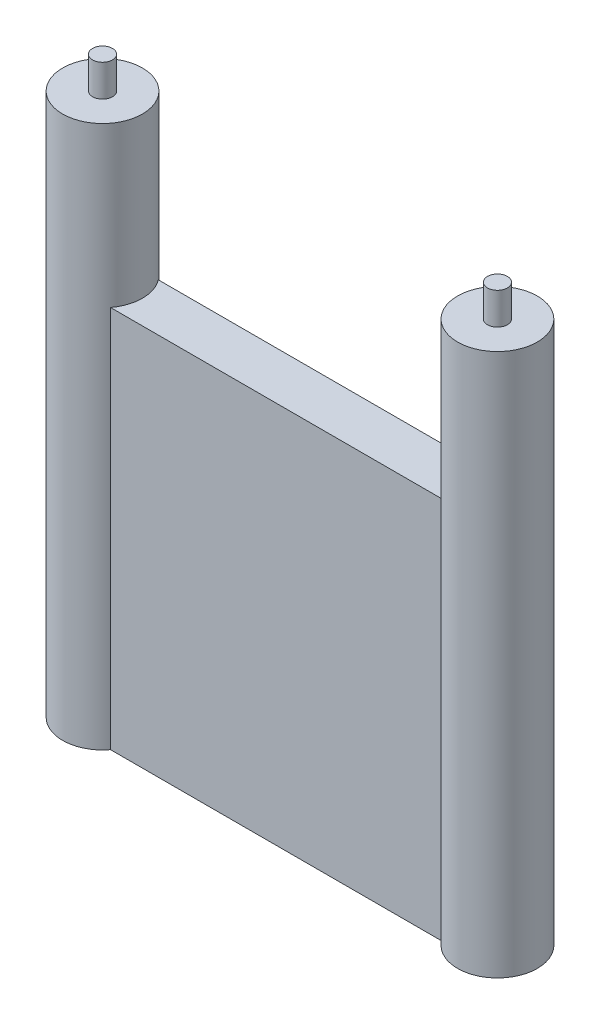
ISO-10303-21;
HEADER;
FILE_DESCRIPTION(('STEP AP214'),'2;1');
FILE_NAME('part.step','',(''),(''),'','','');
FILE_SCHEMA(('AUTOMOTIVE_DESIGN { 1 0 10303 214 1 1 1 1 }'));
ENDSEC;
DATA;
#1=APPLICATION_CONTEXT('core data for automotive mechanical design processes');
#2=APPLICATION_PROTOCOL_DEFINITION('international standard','automotive_design',2000,#1);
#3=PRODUCT_CONTEXT('',#1,'mechanical');
#4=PRODUCT('Part','Part','',(#3));
#5=PRODUCT_RELATED_PRODUCT_CATEGORY('part','',(#4));
#6=PRODUCT_DEFINITION_FORMATION('','',#4);
#7=PRODUCT_DEFINITION_CONTEXT('part definition',#1,'design');
#8=PRODUCT_DEFINITION('design','',#6,#7);
#9=PRODUCT_DEFINITION_SHAPE('','',#8);
#10=(LENGTH_UNIT() NAMED_UNIT(*) SI_UNIT(.MILLI.,.METRE.));
#11=(NAMED_UNIT(*) PLANE_ANGLE_UNIT() SI_UNIT($,.RADIAN.));
#12=(NAMED_UNIT(*) SI_UNIT($,.STERADIAN.) SOLID_ANGLE_UNIT());
#13=UNCERTAINTY_MEASURE_WITH_UNIT(LENGTH_MEASURE(1.E-05),#10,'distance_accuracy_value','');
#14=(GEOMETRIC_REPRESENTATION_CONTEXT(3) GLOBAL_UNCERTAINTY_ASSIGNED_CONTEXT((#13)) GLOBAL_UNIT_ASSIGNED_CONTEXT((#10,
#11,#12)) REPRESENTATION_CONTEXT('',''));
#15=CARTESIAN_POINT('',(0.,0.,0.));
#16=DIRECTION('',(0.,0.,1.));
#17=DIRECTION('',(1.,0.,0.));
#18=AXIS2_PLACEMENT_3D('',#15,#16,#17);
#19=CARTESIAN_POINT('',(-49.5,68.,0.));
#20=DIRECTION('',(0.,1.,0.));
#21=DIRECTION('',(0.,0.,1.));
#22=AXIS2_PLACEMENT_3D('',#19,#20,#21);
#23=PLANE('',#22);
#24=CARTESIAN_POINT('',(-49.5,68.,0.));
#25=DIRECTION('',(0.,1.,0.));
#26=DIRECTION('',(0.,0.,1.));
#27=AXIS2_PLACEMENT_3D('',#24,#25,#26);
#28=CIRCLE('',#27,1.25);
#29=CARTESIAN_POINT('',(-49.5,68.,1.25));
#30=VERTEX_POINT('',#29);
#31=EDGE_CURVE('E85',#30,#30,#28,.T.);
#32=ORIENTED_EDGE('',*,*,#31,.F.);
#33=EDGE_LOOP('',(#32));
#34=FACE_BOUND('',#33,.T.);
#35=CARTESIAN_POINT('',(-49.5,68.,0.));
#36=DIRECTION('',(0.,1.,0.));
#37=DIRECTION('',(0.,0.,1.));
#38=AXIS2_PLACEMENT_3D('',#35,#36,#37);
#39=CIRCLE('',#38,5.);
#40=CARTESIAN_POINT('',(-49.5,68.,5.));
#41=VERTEX_POINT('',#40);
#42=EDGE_CURVE('E150',#41,#41,#39,.T.);
#43=ORIENTED_EDGE('',*,*,#42,.T.);
#44=EDGE_LOOP('',(#43));
#45=FACE_BOUND('',#44,.T.);
#46=ADVANCED_FACE('F76',(#34,#45),#23,.T.);
#47=CARTESIAN_POINT('',(0.,68.,0.));
#48=DIRECTION('',(0.,1.,0.));
#49=DIRECTION('',(0.,0.,1.));
#50=AXIS2_PLACEMENT_3D('',#47,#48,#49);
#51=CIRCLE('',#50,1.25);
#52=CARTESIAN_POINT('',(0.,68.,1.25));
#53=VERTEX_POINT('',#52);
#54=EDGE_CURVE('E159',#53,#53,#51,.T.);
#55=ORIENTED_EDGE('',*,*,#54,.F.);
#56=EDGE_LOOP('',(#55));
#57=FACE_BOUND('',#56,.T.);
#58=CARTESIAN_POINT('',(0.,68.,0.));
#59=DIRECTION('',(0.,1.,0.));
#60=DIRECTION('',(0.,0.,1.));
#61=AXIS2_PLACEMENT_3D('',#58,#59,#60);
#62=CIRCLE('',#61,5.);
#63=CARTESIAN_POINT('',(0.,68.,5.));
#64=VERTEX_POINT('',#63);
#65=EDGE_CURVE('E132',#64,#64,#62,.T.);
#66=ORIENTED_EDGE('',*,*,#65,.T.);
#67=EDGE_LOOP('',(#66));
#68=FACE_BOUND('',#67,.T.);
#69=ADVANCED_FACE('F198',(#57,#68),#23,.T.);
#70=CARTESIAN_POINT('',(-49.5,0.,0.));
#71=DIRECTION('',(0.,1.,0.));
#72=DIRECTION('',(0.,0.,1.));
#73=AXIS2_PLACEMENT_3D('',#70,#71,#72);
#74=PLANE('',#73);
#75=CARTESIAN_POINT('',(-49.5,0.,0.));
#76=DIRECTION('',(0.,1.,0.));
#77=DIRECTION('',(0.,0.,1.));
#78=AXIS2_PLACEMENT_3D('',#75,#76,#77);
#79=CIRCLE('',#78,5.);
#80=CARTESIAN_POINT('',(-45.5,0.,-3.));
#81=VERTEX_POINT('',#80);
#82=CARTESIAN_POINT('',(-45.5,0.,3.));
#83=VERTEX_POINT('',#82);
#84=EDGE_CURVE('E148',#81,#83,#79,.T.);
#85=ORIENTED_EDGE('',*,*,#84,.F.);
#86=DIRECTION('',(1.,0.,0.));
#87=VECTOR('',#86,1.);
#88=CARTESIAN_POINT('',(-49.5,0.,-3.));
#89=LINE('',#88,#87);
#90=CARTESIAN_POINT('',(-4.,0.,-3.));
#91=VERTEX_POINT('',#90);
#92=EDGE_CURVE('E125',#81,#91,#89,.T.);
#93=ORIENTED_EDGE('',*,*,#92,.T.);
#94=CARTESIAN_POINT('',(0.,0.,0.));
#95=DIRECTION('',(0.,1.,0.));
#96=DIRECTION('',(0.,0.,1.));
#97=AXIS2_PLACEMENT_3D('',#94,#95,#96);
#98=CIRCLE('',#97,5.);
#99=CARTESIAN_POINT('',(-4.,0.,3.));
#100=VERTEX_POINT('',#99);
#101=EDGE_CURVE('E124',#100,#91,#98,.T.);
#102=ORIENTED_EDGE('',*,*,#101,.F.);
#103=DIRECTION('',(1.,0.,0.));
#104=VECTOR('',#103,1.);
#105=CARTESIAN_POINT('',(-49.5,0.,3.));
#106=LINE('',#105,#104);
#107=EDGE_CURVE('E115',#83,#100,#106,.T.);
#108=ORIENTED_EDGE('',*,*,#107,.F.);
#109=EDGE_LOOP('',(#85,#93,#102,#108));
#110=FACE_BOUND('',#109,.T.);
#111=ADVANCED_FACE('F134',(#110),#74,.F.);
#112=CARTESIAN_POINT('',(-49.5,68.,0.));
#113=DIRECTION('',(0.,-1.,0.));
#114=DIRECTION('',(0.,0.,-1.));
#115=AXIS2_PLACEMENT_3D('',#112,#113,#114);
#116=CYLINDRICAL_SURFACE('',#115,5.);
#117=DIRECTION('',(0.,-1.,0.));
#118=VECTOR('',#117,1.);
#119=CARTESIAN_POINT('',(-45.5,68.,3.));
#120=LINE('',#119,#118);
#121=CARTESIAN_POINT('',(-45.5,48.,3.));
#122=VERTEX_POINT('',#121);
#123=EDGE_CURVE('E119',#122,#83,#120,.T.);
#124=ORIENTED_EDGE('',*,*,#123,.F.);
#125=CARTESIAN_POINT('',(-49.5,48.,0.));
#126=DIRECTION('',(0.,1.,0.));
#127=DIRECTION('',(0.,0.,1.));
#128=AXIS2_PLACEMENT_3D('',#125,#126,#127);
#129=CIRCLE('',#128,5.);
#130=CARTESIAN_POINT('',(-45.5,48.,-3.));
#131=VERTEX_POINT('',#130);
#132=EDGE_CURVE('E173',#122,#131,#129,.T.);
#133=ORIENTED_EDGE('',*,*,#132,.T.);
#134=DIRECTION('',(0.,-1.,0.));
#135=VECTOR('',#134,1.);
#136=CARTESIAN_POINT('',(-45.5,68.,-3.));
#137=LINE('',#136,#135);
#138=EDGE_CURVE('E101',#131,#81,#137,.T.);
#139=ORIENTED_EDGE('',*,*,#138,.T.);
#140=ORIENTED_EDGE('',*,*,#84,.T.);
#141=EDGE_LOOP('',(#124,#133,#139,#140));
#142=FACE_BOUND('',#141,.T.);
#143=ORIENTED_EDGE('',*,*,#42,.F.);
#144=EDGE_LOOP('',(#143));
#145=FACE_BOUND('',#144,.T.);
#146=ADVANCED_FACE('F169',(#142,#145),#116,.T.);
#147=CARTESIAN_POINT('',(0.,68.,0.));
#148=DIRECTION('',(0.,-1.,0.));
#149=DIRECTION('',(0.,0.,-1.));
#150=AXIS2_PLACEMENT_3D('',#147,#148,#149);
#151=CYLINDRICAL_SURFACE('',#150,5.);
#152=DIRECTION('',(0.,-1.,0.));
#153=VECTOR('',#152,1.);
#154=CARTESIAN_POINT('',(-4.,68.,-3.));
#155=LINE('',#154,#153);
#156=CARTESIAN_POINT('',(-4.,48.,-3.));
#157=VERTEX_POINT('',#156);
#158=EDGE_CURVE('E131',#91,#157,#155,.F.);
#159=ORIENTED_EDGE('',*,*,#158,.T.);
#160=CARTESIAN_POINT('',(0.,48.,0.));
#161=DIRECTION('',(0.,1.,0.));
#162=DIRECTION('',(0.,0.,1.));
#163=AXIS2_PLACEMENT_3D('',#160,#161,#162);
#164=CIRCLE('',#163,5.);
#165=CARTESIAN_POINT('',(-4.,48.,3.));
#166=VERTEX_POINT('',#165);
#167=EDGE_CURVE('E92',#157,#166,#164,.T.);
#168=ORIENTED_EDGE('',*,*,#167,.T.);
#169=DIRECTION('',(0.,-1.,0.));
#170=VECTOR('',#169,1.);
#171=CARTESIAN_POINT('',(-4.,68.,3.));
#172=LINE('',#171,#170);
#173=EDGE_CURVE('E117',#100,#166,#172,.F.);
#174=ORIENTED_EDGE('',*,*,#173,.F.);
#175=ORIENTED_EDGE('',*,*,#101,.T.);
#176=EDGE_LOOP('',(#159,#168,#174,#175));
#177=FACE_BOUND('',#176,.T.);
#178=ORIENTED_EDGE('',*,*,#65,.F.);
#179=EDGE_LOOP('',(#178));
#180=FACE_BOUND('',#179,.T.);
#181=ADVANCED_FACE('F128',(#177,#180),#151,.T.);
#182=CARTESIAN_POINT('',(-49.5,68.,-3.));
#183=DIRECTION('',(0.,0.,-1.));
#184=DIRECTION('',(-1.,0.,0.));
#185=AXIS2_PLACEMENT_3D('',#182,#183,#184);
#186=PLANE('',#185);
#187=DIRECTION('',(-1.,0.,0.));
#188=VECTOR('',#187,1.);
#189=CARTESIAN_POINT('',(-49.5,48.,-3.));
#190=LINE('',#189,#188);
#191=EDGE_CURVE('E165',#157,#131,#190,.T.);
#192=ORIENTED_EDGE('',*,*,#191,.F.);
#193=ORIENTED_EDGE('',*,*,#158,.F.);
#194=ORIENTED_EDGE('',*,*,#92,.F.);
#195=ORIENTED_EDGE('',*,*,#138,.F.);
#196=EDGE_LOOP('',(#192,#193,#194,#195));
#197=FACE_BOUND('',#196,.T.);
#198=ADVANCED_FACE('F78',(#197),#186,.T.);
#199=CARTESIAN_POINT('',(-49.5,68.,3.));
#200=DIRECTION('',(0.,0.,-1.));
#201=DIRECTION('',(-1.,0.,0.));
#202=AXIS2_PLACEMENT_3D('',#199,#200,#201);
#203=PLANE('',#202);
#204=ORIENTED_EDGE('',*,*,#173,.T.);
#205=DIRECTION('',(-1.,0.,0.));
#206=VECTOR('',#205,1.);
#207=CARTESIAN_POINT('',(-49.5,48.,3.));
#208=LINE('',#207,#206);
#209=EDGE_CURVE('E12',#166,#122,#208,.T.);
#210=ORIENTED_EDGE('',*,*,#209,.T.);
#211=ORIENTED_EDGE('',*,*,#123,.T.);
#212=ORIENTED_EDGE('',*,*,#107,.T.);
#213=EDGE_LOOP('',(#204,#210,#211,#212));
#214=FACE_BOUND('',#213,.T.);
#215=ADVANCED_FACE('F116',(#214),#203,.F.);
#216=CARTESIAN_POINT('',(0.,72.,0.));
#217=DIRECTION('',(0.,-1.,0.));
#218=DIRECTION('',(0.,0.,-1.));
#219=AXIS2_PLACEMENT_3D('',#216,#217,#218);
#220=CYLINDRICAL_SURFACE('',#219,1.25);
#221=CARTESIAN_POINT('',(0.,72.,0.));
#222=DIRECTION('',(0.,1.,0.));
#223=DIRECTION('',(0.,0.,1.));
#224=AXIS2_PLACEMENT_3D('',#221,#222,#223);
#225=CIRCLE('',#224,1.25);
#226=CARTESIAN_POINT('',(0.,72.,1.25));
#227=VERTEX_POINT('',#226);
#228=EDGE_CURVE('E144',#227,#227,#225,.T.);
#229=ORIENTED_EDGE('',*,*,#228,.F.);
#230=EDGE_LOOP('',(#229));
#231=FACE_BOUND('',#230,.T.);
#232=ORIENTED_EDGE('',*,*,#54,.T.);
#233=EDGE_LOOP('',(#232));
#234=FACE_BOUND('',#233,.T.);
#235=ADVANCED_FACE('F196',(#231,#234),#220,.T.);
#236=CARTESIAN_POINT('',(0.,72.,0.));
#237=DIRECTION('',(0.,1.,0.));
#238=DIRECTION('',(0.,0.,1.));
#239=AXIS2_PLACEMENT_3D('',#236,#237,#238);
#240=PLANE('',#239);
#241=ORIENTED_EDGE('',*,*,#228,.T.);
#242=EDGE_LOOP('',(#241));
#243=FACE_BOUND('',#242,.T.);
#244=ADVANCED_FACE('F211',(#243),#240,.T.);
#245=CARTESIAN_POINT('',(-49.5,72.,0.));
#246=DIRECTION('',(0.,-1.,0.));
#247=DIRECTION('',(0.,0.,-1.));
#248=AXIS2_PLACEMENT_3D('',#245,#246,#247);
#249=CYLINDRICAL_SURFACE('',#248,1.25);
#250=CARTESIAN_POINT('',(-49.5,72.,0.));
#251=DIRECTION('',(0.,1.,0.));
#252=DIRECTION('',(0.,0.,1.));
#253=AXIS2_PLACEMENT_3D('',#250,#251,#252);
#254=CIRCLE('',#253,1.25);
#255=CARTESIAN_POINT('',(-49.5,72.,1.25));
#256=VERTEX_POINT('',#255);
#257=EDGE_CURVE('E161',#256,#256,#254,.T.);
#258=ORIENTED_EDGE('',*,*,#257,.F.);
#259=EDGE_LOOP('',(#258));
#260=FACE_BOUND('',#259,.T.);
#261=ORIENTED_EDGE('',*,*,#31,.T.);
#262=EDGE_LOOP('',(#261));
#263=FACE_BOUND('',#262,.T.);
#264=ADVANCED_FACE('F241',(#260,#263),#249,.T.);
#265=CARTESIAN_POINT('',(-49.5,72.,0.));
#266=DIRECTION('',(0.,1.,0.));
#267=DIRECTION('',(0.,0.,1.));
#268=AXIS2_PLACEMENT_3D('',#265,#266,#267);
#269=PLANE('',#268);
#270=ORIENTED_EDGE('',*,*,#257,.T.);
#271=EDGE_LOOP('',(#270));
#272=FACE_BOUND('',#271,.T.);
#273=ADVANCED_FACE('F222',(#272),#269,.T.);
#274=CARTESIAN_POINT('',(0.,48.,0.));
#275=DIRECTION('',(0.,-1.,0.));
#276=DIRECTION('',(0.,0.,-1.));
#277=AXIS2_PLACEMENT_3D('',#274,#275,#276);
#278=PLANE('',#277);
#279=ORIENTED_EDGE('',*,*,#191,.T.);
#280=ORIENTED_EDGE('',*,*,#132,.F.);
#281=ORIENTED_EDGE('',*,*,#209,.F.);
#282=ORIENTED_EDGE('',*,*,#167,.F.);
#283=EDGE_LOOP('',(#279,#280,#281,#282));
#284=FACE_BOUND('',#283,.T.);
#285=ADVANCED_FACE('F180',(#284),#278,.F.);
#286=CLOSED_SHELL('',(#46,#69,#111,#146,#181,#198,#215,#235,#244,#264,#273,#285));
#287=MANIFOLD_SOLID_BREP('B2',#286);
#288=ADVANCED_BREP_SHAPE_REPRESENTATION('',(#18,#287),#14);
#289=SHAPE_DEFINITION_REPRESENTATION(#9,#288);
ENDSEC;
END-ISO-10303-21;
